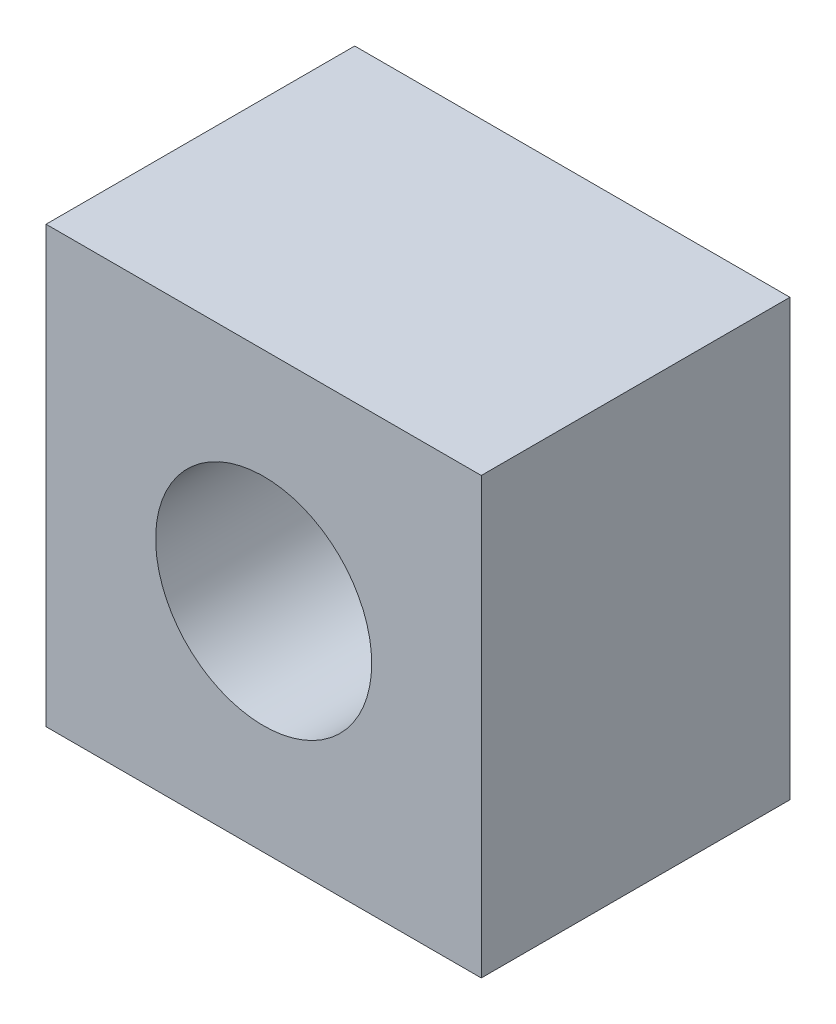
ISO-10303-21;
HEADER;
FILE_DESCRIPTION(('STEP AP214'),'2;1');
FILE_NAME('part.step','',(''),(''),'','','');
FILE_SCHEMA(('AUTOMOTIVE_DESIGN { 1 0 10303 214 1 1 1 1 }'));
ENDSEC;
DATA;
#1=APPLICATION_CONTEXT('core data for automotive mechanical design processes');
#2=APPLICATION_PROTOCOL_DEFINITION('international standard','automotive_design',2000,#1);
#3=PRODUCT_CONTEXT('',#1,'mechanical');
#4=PRODUCT('Part','Part','',(#3));
#5=PRODUCT_RELATED_PRODUCT_CATEGORY('part','',(#4));
#6=PRODUCT_DEFINITION_FORMATION('','',#4);
#7=PRODUCT_DEFINITION_CONTEXT('part definition',#1,'design');
#8=PRODUCT_DEFINITION('design','',#6,#7);
#9=PRODUCT_DEFINITION_SHAPE('','',#8);
#10=(LENGTH_UNIT() NAMED_UNIT(*) SI_UNIT(.MILLI.,.METRE.));
#11=(NAMED_UNIT(*) PLANE_ANGLE_UNIT() SI_UNIT($,.RADIAN.));
#12=(NAMED_UNIT(*) SI_UNIT($,.STERADIAN.) SOLID_ANGLE_UNIT());
#13=UNCERTAINTY_MEASURE_WITH_UNIT(LENGTH_MEASURE(1.E-05),#10,'distance_accuracy_value','');
#14=(GEOMETRIC_REPRESENTATION_CONTEXT(3) GLOBAL_UNCERTAINTY_ASSIGNED_CONTEXT((#13)) GLOBAL_UNIT_ASSIGNED_CONTEXT((#10,
#11,#12)) REPRESENTATION_CONTEXT('',''));
#15=CARTESIAN_POINT('',(0.,0.,0.));
#16=DIRECTION('',(0.,0.,1.));
#17=DIRECTION('',(1.,0.,0.));
#18=AXIS2_PLACEMENT_3D('',#15,#16,#17);
#19=CARTESIAN_POINT('',(-7.05,-7.05,10.));
#20=DIRECTION('',(0.,0.,1.));
#21=DIRECTION('',(1.,0.,0.));
#22=AXIS2_PLACEMENT_3D('',#19,#20,#21);
#23=PLANE('',#22);
#24=DIRECTION('',(0.,-1.,0.));
#25=VECTOR('',#24,1.);
#26=CARTESIAN_POINT('',(-7.05,7.05,10.));
#27=LINE('',#26,#25);
#28=CARTESIAN_POINT('',(-7.05,7.05,10.));
#29=VERTEX_POINT('',#28);
#30=CARTESIAN_POINT('',(-7.05,-7.05,10.));
#31=VERTEX_POINT('',#30);
#32=EDGE_CURVE('E104',#29,#31,#27,.T.);
#33=ORIENTED_EDGE('',*,*,#32,.T.);
#34=DIRECTION('',(1.,0.,0.));
#35=VECTOR('',#34,1.);
#36=CARTESIAN_POINT('',(-7.05,-7.05,10.));
#37=LINE('',#36,#35);
#38=CARTESIAN_POINT('',(7.05,-7.05,10.));
#39=VERTEX_POINT('',#38);
#40=EDGE_CURVE('E89',#31,#39,#37,.T.);
#41=ORIENTED_EDGE('',*,*,#40,.T.);
#42=DIRECTION('',(0.,1.,0.));
#43=VECTOR('',#42,1.);
#44=CARTESIAN_POINT('',(7.05,7.05,10.));
#45=LINE('',#44,#43);
#46=CARTESIAN_POINT('',(7.05,7.05,10.));
#47=VERTEX_POINT('',#46);
#48=EDGE_CURVE('E55',#39,#47,#45,.T.);
#49=ORIENTED_EDGE('',*,*,#48,.T.);
#50=DIRECTION('',(-1.,0.,0.));
#51=VECTOR('',#50,1.);
#52=CARTESIAN_POINT('',(-7.05,7.05,10.));
#53=LINE('',#52,#51);
#54=EDGE_CURVE('E50',#47,#29,#53,.T.);
#55=ORIENTED_EDGE('',*,*,#54,.T.);
#56=EDGE_LOOP('',(#33,#41,#49,#55));
#57=FACE_BOUND('',#56,.T.);
#58=CARTESIAN_POINT('',(0.,0.,10.));
#59=DIRECTION('',(0.,0.,1.));
#60=DIRECTION('',(1.,0.,0.));
#61=AXIS2_PLACEMENT_3D('',#58,#59,#60);
#62=CIRCLE('',#61,3.5);
#63=CARTESIAN_POINT('',(3.5,0.,10.));
#64=VERTEX_POINT('',#63);
#65=EDGE_CURVE('E94',#64,#64,#62,.T.);
#66=ORIENTED_EDGE('',*,*,#65,.F.);
#67=EDGE_LOOP('',(#66));
#68=FACE_BOUND('',#67,.T.);
#69=ADVANCED_FACE('F35',(#57,#68),#23,.T.);
#70=CARTESIAN_POINT('',(-7.05,-7.05,0.));
#71=DIRECTION('',(0.,0.,1.));
#72=DIRECTION('',(1.,0.,0.));
#73=AXIS2_PLACEMENT_3D('',#70,#71,#72);
#74=PLANE('',#73);
#75=DIRECTION('',(0.,-1.,0.));
#76=VECTOR('',#75,1.);
#77=CARTESIAN_POINT('',(-7.05,7.05,0.));
#78=LINE('',#77,#76);
#79=CARTESIAN_POINT('',(-7.05,7.05,0.));
#80=VERTEX_POINT('',#79);
#81=CARTESIAN_POINT('',(-7.05,-7.05,0.));
#82=VERTEX_POINT('',#81);
#83=EDGE_CURVE('E81',#80,#82,#78,.T.);
#84=ORIENTED_EDGE('',*,*,#83,.F.);
#85=DIRECTION('',(-1.,0.,0.));
#86=VECTOR('',#85,1.);
#87=CARTESIAN_POINT('',(-7.05,7.05,0.));
#88=LINE('',#87,#86);
#89=CARTESIAN_POINT('',(7.05,7.05,0.));
#90=VERTEX_POINT('',#89);
#91=EDGE_CURVE('E102',#90,#80,#88,.T.);
#92=ORIENTED_EDGE('',*,*,#91,.F.);
#93=DIRECTION('',(0.,1.,0.));
#94=VECTOR('',#93,1.);
#95=CARTESIAN_POINT('',(7.05,7.05,0.));
#96=LINE('',#95,#94);
#97=CARTESIAN_POINT('',(7.05,-7.05,0.));
#98=VERTEX_POINT('',#97);
#99=EDGE_CURVE('E82',#98,#90,#96,.T.);
#100=ORIENTED_EDGE('',*,*,#99,.F.);
#101=DIRECTION('',(1.,0.,0.));
#102=VECTOR('',#101,1.);
#103=CARTESIAN_POINT('',(-7.05,-7.05,0.));
#104=LINE('',#103,#102);
#105=EDGE_CURVE('E76',#82,#98,#104,.T.);
#106=ORIENTED_EDGE('',*,*,#105,.F.);
#107=EDGE_LOOP('',(#84,#92,#100,#106));
#108=FACE_BOUND('',#107,.T.);
#109=CARTESIAN_POINT('',(0.,0.,0.));
#110=DIRECTION('',(0.,0.,1.));
#111=DIRECTION('',(1.,0.,0.));
#112=AXIS2_PLACEMENT_3D('',#109,#110,#111);
#113=CIRCLE('',#112,3.5);
#114=CARTESIAN_POINT('',(3.5,0.,0.));
#115=VERTEX_POINT('',#114);
#116=EDGE_CURVE('E97',#115,#115,#113,.T.);
#117=ORIENTED_EDGE('',*,*,#116,.T.);
#118=EDGE_LOOP('',(#117));
#119=FACE_BOUND('',#118,.T.);
#120=ADVANCED_FACE('F77',(#108,#119),#74,.F.);
#121=CARTESIAN_POINT('',(-7.05,7.05,10.));
#122=DIRECTION('',(1.,0.,0.));
#123=DIRECTION('',(0.,1.,0.));
#124=AXIS2_PLACEMENT_3D('',#121,#122,#123);
#125=PLANE('',#124);
#126=ORIENTED_EDGE('',*,*,#83,.T.);
#127=DIRECTION('',(0.,0.,-1.));
#128=VECTOR('',#127,1.);
#129=CARTESIAN_POINT('',(-7.05,-7.05,10.));
#130=LINE('',#129,#128);
#131=EDGE_CURVE('E11',#31,#82,#130,.T.);
#132=ORIENTED_EDGE('',*,*,#131,.F.);
#133=ORIENTED_EDGE('',*,*,#32,.F.);
#134=DIRECTION('',(0.,0.,-1.));
#135=VECTOR('',#134,1.);
#136=CARTESIAN_POINT('',(-7.05,7.05,10.));
#137=LINE('',#136,#135);
#138=EDGE_CURVE('E93',#29,#80,#137,.T.);
#139=ORIENTED_EDGE('',*,*,#138,.T.);
#140=EDGE_LOOP('',(#126,#132,#133,#139));
#141=FACE_BOUND('',#140,.T.);
#142=ADVANCED_FACE('F37',(#141),#125,.F.);
#143=CARTESIAN_POINT('',(-7.05,-7.05,10.));
#144=DIRECTION('',(0.,1.,0.));
#145=DIRECTION('',(0.,0.,1.));
#146=AXIS2_PLACEMENT_3D('',#143,#144,#145);
#147=PLANE('',#146);
#148=ORIENTED_EDGE('',*,*,#105,.T.);
#149=DIRECTION('',(0.,0.,-1.));
#150=VECTOR('',#149,1.);
#151=CARTESIAN_POINT('',(7.05,-7.05,10.));
#152=LINE('',#151,#150);
#153=EDGE_CURVE('E43',#39,#98,#152,.T.);
#154=ORIENTED_EDGE('',*,*,#153,.F.);
#155=ORIENTED_EDGE('',*,*,#40,.F.);
#156=ORIENTED_EDGE('',*,*,#131,.T.);
#157=EDGE_LOOP('',(#148,#154,#155,#156));
#158=FACE_BOUND('',#157,.T.);
#159=ADVANCED_FACE('F88',(#158),#147,.F.);
#160=CARTESIAN_POINT('',(7.05,7.05,10.));
#161=DIRECTION('',(-1.,0.,0.));
#162=DIRECTION('',(0.,-1.,0.));
#163=AXIS2_PLACEMENT_3D('',#160,#161,#162);
#164=PLANE('',#163);
#165=ORIENTED_EDGE('',*,*,#99,.T.);
#166=DIRECTION('',(0.,0.,-1.));
#167=VECTOR('',#166,1.);
#168=CARTESIAN_POINT('',(7.05,7.05,10.));
#169=LINE('',#168,#167);
#170=EDGE_CURVE('E110',#47,#90,#169,.T.);
#171=ORIENTED_EDGE('',*,*,#170,.F.);
#172=ORIENTED_EDGE('',*,*,#48,.F.);
#173=ORIENTED_EDGE('',*,*,#153,.T.);
#174=EDGE_LOOP('',(#165,#171,#172,#173));
#175=FACE_BOUND('',#174,.T.);
#176=ADVANCED_FACE('F113',(#175),#164,.F.);
#177=CARTESIAN_POINT('',(-7.05,7.05,10.));
#178=DIRECTION('',(0.,-1.,0.));
#179=DIRECTION('',(1.,0.,0.));
#180=AXIS2_PLACEMENT_3D('',#177,#178,#179);
#181=PLANE('',#180);
#182=ORIENTED_EDGE('',*,*,#91,.T.);
#183=ORIENTED_EDGE('',*,*,#138,.F.);
#184=ORIENTED_EDGE('',*,*,#54,.F.);
#185=ORIENTED_EDGE('',*,*,#170,.T.);
#186=EDGE_LOOP('',(#182,#183,#184,#185));
#187=FACE_BOUND('',#186,.T.);
#188=ADVANCED_FACE('F115',(#187),#181,.F.);
#189=CARTESIAN_POINT('',(0.,0.,10.));
#190=DIRECTION('',(0.,0.,-1.));
#191=DIRECTION('',(-1.,0.,0.));
#192=AXIS2_PLACEMENT_3D('',#189,#190,#191);
#193=CYLINDRICAL_SURFACE('',#192,3.5);
#194=ORIENTED_EDGE('',*,*,#65,.T.);
#195=EDGE_LOOP('',(#194));
#196=FACE_BOUND('',#195,.T.);
#197=ORIENTED_EDGE('',*,*,#116,.F.);
#198=EDGE_LOOP('',(#197));
#199=FACE_BOUND('',#198,.T.);
#200=ADVANCED_FACE('F121',(#196,#199),#193,.F.);
#201=CLOSED_SHELL('',(#69,#120,#142,#159,#176,#188,#200));
#202=MANIFOLD_SOLID_BREP('B2',#201);
#203=ADVANCED_BREP_SHAPE_REPRESENTATION('',(#18,#202),#14);
#204=SHAPE_DEFINITION_REPRESENTATION(#9,#203);
ENDSEC;
END-ISO-10303-21;
